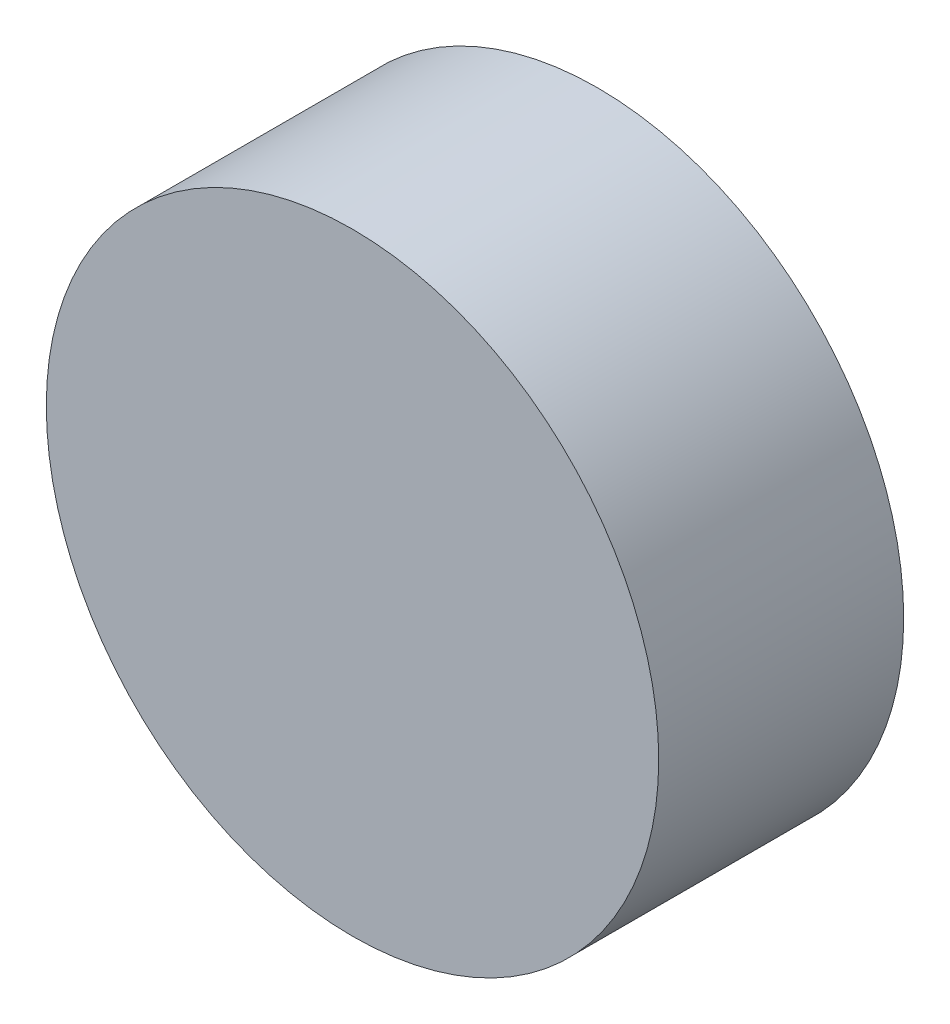
ISO-10303-21;
HEADER;
FILE_DESCRIPTION(('STEP AP214'),'2;1');
FILE_NAME('part.step','',(''),(''),'','','');
FILE_SCHEMA(('AUTOMOTIVE_DESIGN { 1 0 10303 214 1 1 1 1 }'));
ENDSEC;
DATA;
#1=APPLICATION_CONTEXT('core data for automotive mechanical design processes');
#2=APPLICATION_PROTOCOL_DEFINITION('international standard','automotive_design',2000,#1);
#3=PRODUCT_CONTEXT('',#1,'mechanical');
#4=PRODUCT('Part','Part','',(#3));
#5=PRODUCT_RELATED_PRODUCT_CATEGORY('part','',(#4));
#6=PRODUCT_DEFINITION_FORMATION('','',#4);
#7=PRODUCT_DEFINITION_CONTEXT('part definition',#1,'design');
#8=PRODUCT_DEFINITION('design','',#6,#7);
#9=PRODUCT_DEFINITION_SHAPE('','',#8);
#10=(LENGTH_UNIT() NAMED_UNIT(*) SI_UNIT(.MILLI.,.METRE.));
#11=(NAMED_UNIT(*) PLANE_ANGLE_UNIT() SI_UNIT($,.RADIAN.));
#12=(NAMED_UNIT(*) SI_UNIT($,.STERADIAN.) SOLID_ANGLE_UNIT());
#13=UNCERTAINTY_MEASURE_WITH_UNIT(LENGTH_MEASURE(1.E-05),#10,'distance_accuracy_value','');
#14=(GEOMETRIC_REPRESENTATION_CONTEXT(3) GLOBAL_UNCERTAINTY_ASSIGNED_CONTEXT((#13)) GLOBAL_UNIT_ASSIGNED_CONTEXT((#10,
#11,#12)) REPRESENTATION_CONTEXT('',''));
#15=CARTESIAN_POINT('',(0.,0.,0.));
#16=DIRECTION('',(0.,0.,1.));
#17=DIRECTION('',(1.,0.,0.));
#18=AXIS2_PLACEMENT_3D('',#15,#16,#17);
#19=CARTESIAN_POINT('',(0.,0.,-6.));
#20=DIRECTION('',(0.,0.,1.));
#21=DIRECTION('',(1.,0.,0.));
#22=AXIS2_PLACEMENT_3D('',#19,#20,#21);
#23=CYLINDRICAL_SURFACE('',#22,15.);
#24=CARTESIAN_POINT('',(0.,0.,-6.));
#25=DIRECTION('',(0.,0.,1.));
#26=DIRECTION('',(1.,0.,0.));
#27=AXIS2_PLACEMENT_3D('',#24,#25,#26);
#28=CIRCLE('',#27,15.);
#29=CARTESIAN_POINT('',(15.,0.,-6.));
#30=VERTEX_POINT('',#29);
#31=EDGE_CURVE('E10',#30,#30,#28,.T.);
#32=ORIENTED_EDGE('',*,*,#31,.T.);
#33=EDGE_LOOP('',(#32));
#34=FACE_BOUND('',#33,.T.);
#35=CARTESIAN_POINT('',(0.,0.,6.));
#36=DIRECTION('',(0.,0.,1.));
#37=DIRECTION('',(1.,0.,0.));
#38=AXIS2_PLACEMENT_3D('',#35,#36,#37);
#39=CIRCLE('',#38,15.);
#40=CARTESIAN_POINT('',(15.,0.,6.));
#41=VERTEX_POINT('',#40);
#42=EDGE_CURVE('E40',#41,#41,#39,.T.);
#43=ORIENTED_EDGE('',*,*,#42,.F.);
#44=EDGE_LOOP('',(#43));
#45=FACE_BOUND('',#44,.T.);
#46=ADVANCED_FACE('F37',(#34,#45),#23,.T.);
#47=CARTESIAN_POINT('',(0.,0.,-6.));
#48=DIRECTION('',(0.,0.,1.));
#49=DIRECTION('',(1.,0.,0.));
#50=AXIS2_PLACEMENT_3D('',#47,#48,#49);
#51=PLANE('',#50);
#52=ORIENTED_EDGE('',*,*,#31,.F.);
#53=EDGE_LOOP('',(#52));
#54=FACE_BOUND('',#53,.T.);
#55=ADVANCED_FACE('F52',(#54),#51,.F.);
#56=CARTESIAN_POINT('',(0.,0.,6.));
#57=DIRECTION('',(0.,0.,1.));
#58=DIRECTION('',(1.,0.,0.));
#59=AXIS2_PLACEMENT_3D('',#56,#57,#58);
#60=PLANE('',#59);
#61=ORIENTED_EDGE('',*,*,#42,.T.);
#62=EDGE_LOOP('',(#61));
#63=FACE_BOUND('',#62,.T.);
#64=ADVANCED_FACE('F49',(#63),#60,.T.);
#65=CLOSED_SHELL('',(#46,#55,#64));
#66=MANIFOLD_SOLID_BREP('B2',#65);
#67=ADVANCED_BREP_SHAPE_REPRESENTATION('',(#18,#66),#14);
#68=SHAPE_DEFINITION_REPRESENTATION(#9,#67);
ENDSEC;
END-ISO-10303-21;
